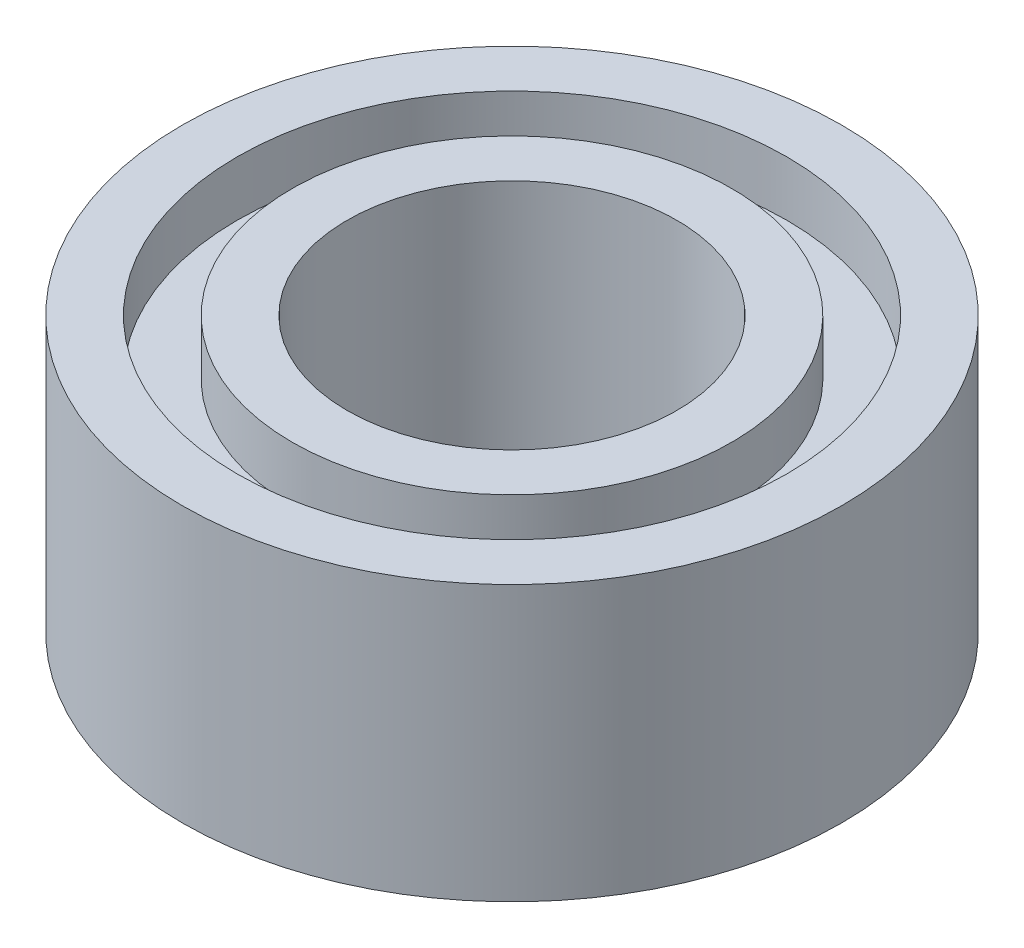
ISO-10303-21;
HEADER;
FILE_DESCRIPTION(('STEP AP214'),'2;1');
FILE_NAME('part.step','',(''),(''),'','','');
FILE_SCHEMA(('AUTOMOTIVE_DESIGN { 1 0 10303 214 1 1 1 1 }'));
ENDSEC;
DATA;
#1=APPLICATION_CONTEXT('core data for automotive mechanical design processes');
#2=APPLICATION_PROTOCOL_DEFINITION('international standard','automotive_design',2000,#1);
#3=PRODUCT_CONTEXT('',#1,'mechanical');
#4=PRODUCT('Part','Part','',(#3));
#5=PRODUCT_RELATED_PRODUCT_CATEGORY('part','',(#4));
#6=PRODUCT_DEFINITION_FORMATION('','',#4);
#7=PRODUCT_DEFINITION_CONTEXT('part definition',#1,'design');
#8=PRODUCT_DEFINITION('design','',#6,#7);
#9=PRODUCT_DEFINITION_SHAPE('','',#8);
#10=(LENGTH_UNIT() NAMED_UNIT(*) SI_UNIT(.MILLI.,.METRE.));
#11=(NAMED_UNIT(*) PLANE_ANGLE_UNIT() SI_UNIT($,.RADIAN.));
#12=(NAMED_UNIT(*) SI_UNIT($,.STERADIAN.) SOLID_ANGLE_UNIT());
#13=UNCERTAINTY_MEASURE_WITH_UNIT(LENGTH_MEASURE(1.E-05),#10,'distance_accuracy_value','');
#14=(GEOMETRIC_REPRESENTATION_CONTEXT(3) GLOBAL_UNCERTAINTY_ASSIGNED_CONTEXT((#13)) GLOBAL_UNIT_ASSIGNED_CONTEXT((#10,
#11,#12)) REPRESENTATION_CONTEXT('',''));
#15=CARTESIAN_POINT('',(0.,0.,0.));
#16=DIRECTION('',(0.,0.,1.));
#17=DIRECTION('',(1.,0.,0.));
#18=AXIS2_PLACEMENT_3D('',#15,#16,#17);
#19=CARTESIAN_POINT('',(0.,0.,0.));
#20=DIRECTION('',(0.,1.,0.));
#21=DIRECTION('',(0.,0.,1.));
#22=AXIS2_PLACEMENT_3D('',#19,#20,#21);
#23=PLANE('',#22);
#24=CARTESIAN_POINT('',(0.,0.,0.));
#25=DIRECTION('',(0.,1.,0.));
#26=DIRECTION('',(0.,0.,1.));
#27=AXIS2_PLACEMENT_3D('',#24,#25,#26);
#28=CIRCLE('',#27,1.5);
#29=CARTESIAN_POINT('',(0.,0.,1.5));
#30=VERTEX_POINT('',#29);
#31=EDGE_CURVE('E46',#30,#30,#28,.T.);
#32=ORIENTED_EDGE('',*,*,#31,.T.);
#33=EDGE_LOOP('',(#32));
#34=FACE_BOUND('',#33,.T.);
#35=CARTESIAN_POINT('',(0.,0.,0.));
#36=DIRECTION('',(0.,-1.,0.));
#37=DIRECTION('',(0.,0.,-1.));
#38=AXIS2_PLACEMENT_3D('',#35,#36,#37);
#39=CIRCLE('',#38,2.);
#40=CARTESIAN_POINT('',(0.,0.,-2.));
#41=VERTEX_POINT('',#40);
#42=EDGE_CURVE('E70',#41,#41,#39,.T.);
#43=ORIENTED_EDGE('',*,*,#42,.T.);
#44=EDGE_LOOP('',(#43));
#45=FACE_BOUND('',#44,.T.);
#46=ADVANCED_FACE('F33',(#34,#45),#23,.F.);
#47=CARTESIAN_POINT('',(0.,2.5,0.));
#48=DIRECTION('',(0.,1.,0.));
#49=DIRECTION('',(0.,0.,1.));
#50=AXIS2_PLACEMENT_3D('',#47,#48,#49);
#51=PLANE('',#50);
#52=CARTESIAN_POINT('',(0.,2.5,0.));
#53=DIRECTION('',(0.,1.,0.));
#54=DIRECTION('',(0.,0.,1.));
#55=AXIS2_PLACEMENT_3D('',#52,#53,#54);
#56=CIRCLE('',#55,1.5);
#57=CARTESIAN_POINT('',(0.,2.5,1.5));
#58=VERTEX_POINT('',#57);
#59=EDGE_CURVE('E44',#58,#58,#56,.T.);
#60=ORIENTED_EDGE('',*,*,#59,.F.);
#61=EDGE_LOOP('',(#60));
#62=FACE_BOUND('',#61,.T.);
#63=CARTESIAN_POINT('',(0.,2.5,0.));
#64=DIRECTION('',(0.,1.,0.));
#65=DIRECTION('',(0.,0.,1.));
#66=AXIS2_PLACEMENT_3D('',#63,#64,#65);
#67=CIRCLE('',#66,2.);
#68=CARTESIAN_POINT('',(0.,2.5,2.));
#69=VERTEX_POINT('',#68);
#70=EDGE_CURVE('E58',#69,#69,#67,.T.);
#71=ORIENTED_EDGE('',*,*,#70,.T.);
#72=EDGE_LOOP('',(#71));
#73=FACE_BOUND('',#72,.T.);
#74=ADVANCED_FACE('F109',(#62,#73),#51,.T.);
#75=CARTESIAN_POINT('',(0.,2.5,0.));
#76=DIRECTION('',(0.,1.,0.));
#77=DIRECTION('',(0.,0.,1.));
#78=AXIS2_PLACEMENT_3D('',#75,#76,#77);
#79=CIRCLE('',#78,2.5);
#80=CARTESIAN_POINT('',(0.,2.5,2.5));
#81=VERTEX_POINT('',#80);
#82=EDGE_CURVE('E52',#81,#81,#79,.T.);
#83=ORIENTED_EDGE('',*,*,#82,.F.);
#84=EDGE_LOOP('',(#83));
#85=FACE_BOUND('',#84,.T.);
#86=CARTESIAN_POINT('',(0.,2.5,0.));
#87=DIRECTION('',(0.,1.,0.));
#88=DIRECTION('',(0.,0.,1.));
#89=AXIS2_PLACEMENT_3D('',#86,#87,#88);
#90=CIRCLE('',#89,3.);
#91=CARTESIAN_POINT('',(0.,2.5,3.));
#92=VERTEX_POINT('',#91);
#93=EDGE_CURVE('E10',#92,#92,#90,.T.);
#94=ORIENTED_EDGE('',*,*,#93,.T.);
#95=EDGE_LOOP('',(#94));
#96=FACE_BOUND('',#95,.T.);
#97=ADVANCED_FACE('F95',(#85,#96),#51,.T.);
#98=CARTESIAN_POINT('',(0.,0.,0.));
#99=DIRECTION('',(0.,-1.,0.));
#100=DIRECTION('',(0.,0.,-1.));
#101=AXIS2_PLACEMENT_3D('',#98,#99,#100);
#102=CIRCLE('',#101,2.5);
#103=CARTESIAN_POINT('',(0.,0.,-2.5));
#104=VERTEX_POINT('',#103);
#105=EDGE_CURVE('E64',#104,#104,#102,.T.);
#106=ORIENTED_EDGE('',*,*,#105,.F.);
#107=EDGE_LOOP('',(#106));
#108=FACE_BOUND('',#107,.T.);
#109=CARTESIAN_POINT('',(0.,0.,0.));
#110=DIRECTION('',(0.,1.,0.));
#111=DIRECTION('',(0.,0.,1.));
#112=AXIS2_PLACEMENT_3D('',#109,#110,#111);
#113=CIRCLE('',#112,3.);
#114=CARTESIAN_POINT('',(0.,0.,3.));
#115=VERTEX_POINT('',#114);
#116=EDGE_CURVE('E37',#115,#115,#113,.T.);
#117=ORIENTED_EDGE('',*,*,#116,.F.);
#118=EDGE_LOOP('',(#117));
#119=FACE_BOUND('',#118,.T.);
#120=ADVANCED_FACE('F92',(#108,#119),#23,.F.);
#121=CARTESIAN_POINT('',(0.,2.5,0.));
#122=DIRECTION('',(0.,-1.,0.));
#123=DIRECTION('',(0.,0.,-1.));
#124=AXIS2_PLACEMENT_3D('',#121,#122,#123);
#125=CYLINDRICAL_SURFACE('',#124,3.);
#126=ORIENTED_EDGE('',*,*,#93,.F.);
#127=EDGE_LOOP('',(#126));
#128=FACE_BOUND('',#127,.T.);
#129=ORIENTED_EDGE('',*,*,#116,.T.);
#130=EDGE_LOOP('',(#129));
#131=FACE_BOUND('',#130,.T.);
#132=ADVANCED_FACE('F35',(#128,#131),#125,.T.);
#133=CARTESIAN_POINT('',(0.,2.5,0.));
#134=DIRECTION('',(0.,-1.,0.));
#135=DIRECTION('',(0.,0.,-1.));
#136=AXIS2_PLACEMENT_3D('',#133,#134,#135);
#137=CYLINDRICAL_SURFACE('',#136,1.5);
#138=ORIENTED_EDGE('',*,*,#59,.T.);
#139=EDGE_LOOP('',(#138));
#140=FACE_BOUND('',#139,.T.);
#141=ORIENTED_EDGE('',*,*,#31,.F.);
#142=EDGE_LOOP('',(#141));
#143=FACE_BOUND('',#142,.T.);
#144=ADVANCED_FACE('F99',(#140,#143),#137,.F.);
#145=CARTESIAN_POINT('',(0.,2.,0.));
#146=DIRECTION('',(0.,1.,0.));
#147=DIRECTION('',(0.,0.,1.));
#148=AXIS2_PLACEMENT_3D('',#145,#146,#147);
#149=CYLINDRICAL_SURFACE('',#148,2.5);
#150=CARTESIAN_POINT('',(0.,2.,0.));
#151=DIRECTION('',(0.,1.,0.));
#152=DIRECTION('',(0.,0.,1.));
#153=AXIS2_PLACEMENT_3D('',#150,#151,#152);
#154=CIRCLE('',#153,2.5);
#155=CARTESIAN_POINT('',(0.,2.,2.5));
#156=VERTEX_POINT('',#155);
#157=EDGE_CURVE('E49',#156,#156,#154,.T.);
#158=ORIENTED_EDGE('',*,*,#157,.F.);
#159=EDGE_LOOP('',(#158));
#160=FACE_BOUND('',#159,.T.);
#161=ORIENTED_EDGE('',*,*,#82,.T.);
#162=EDGE_LOOP('',(#161));
#163=FACE_BOUND('',#162,.T.);
#164=ADVANCED_FACE('F105',(#160,#163),#149,.F.);
#165=CARTESIAN_POINT('',(0.,2.,0.));
#166=DIRECTION('',(0.,1.,0.));
#167=DIRECTION('',(0.,0.,1.));
#168=AXIS2_PLACEMENT_3D('',#165,#166,#167);
#169=PLANE('',#168);
#170=CARTESIAN_POINT('',(0.,2.,0.));
#171=DIRECTION('',(0.,1.,0.));
#172=DIRECTION('',(0.,0.,1.));
#173=AXIS2_PLACEMENT_3D('',#170,#171,#172);
#174=CIRCLE('',#173,2.);
#175=CARTESIAN_POINT('',(0.,2.,2.));
#176=VERTEX_POINT('',#175);
#177=EDGE_CURVE('E55',#176,#176,#174,.T.);
#178=ORIENTED_EDGE('',*,*,#177,.F.);
#179=EDGE_LOOP('',(#178));
#180=FACE_BOUND('',#179,.T.);
#181=ORIENTED_EDGE('',*,*,#157,.T.);
#182=EDGE_LOOP('',(#181));
#183=FACE_BOUND('',#182,.T.);
#184=ADVANCED_FACE('F123',(#180,#183),#169,.T.);
#185=CARTESIAN_POINT('',(0.,2.,0.));
#186=DIRECTION('',(0.,1.,0.));
#187=DIRECTION('',(0.,0.,1.));
#188=AXIS2_PLACEMENT_3D('',#185,#186,#187);
#189=CYLINDRICAL_SURFACE('',#188,2.);
#190=ORIENTED_EDGE('',*,*,#177,.T.);
#191=EDGE_LOOP('',(#190));
#192=FACE_BOUND('',#191,.T.);
#193=ORIENTED_EDGE('',*,*,#70,.F.);
#194=EDGE_LOOP('',(#193));
#195=FACE_BOUND('',#194,.T.);
#196=ADVANCED_FACE('F88',(#192,#195),#189,.T.);
#197=CARTESIAN_POINT('',(0.,0.5,0.));
#198=DIRECTION('',(0.,-1.,0.));
#199=DIRECTION('',(0.,0.,-1.));
#200=AXIS2_PLACEMENT_3D('',#197,#198,#199);
#201=CYLINDRICAL_SURFACE('',#200,2.5);
#202=CARTESIAN_POINT('',(0.,0.5,0.));
#203=DIRECTION('',(0.,-1.,0.));
#204=DIRECTION('',(0.,0.,-1.));
#205=AXIS2_PLACEMENT_3D('',#202,#203,#204);
#206=CIRCLE('',#205,2.5);
#207=CARTESIAN_POINT('',(0.,0.5,-2.5));
#208=VERTEX_POINT('',#207);
#209=EDGE_CURVE('E61',#208,#208,#206,.T.);
#210=ORIENTED_EDGE('',*,*,#209,.F.);
#211=EDGE_LOOP('',(#210));
#212=FACE_BOUND('',#211,.T.);
#213=ORIENTED_EDGE('',*,*,#105,.T.);
#214=EDGE_LOOP('',(#213));
#215=FACE_BOUND('',#214,.T.);
#216=ADVANCED_FACE('F82',(#212,#215),#201,.F.);
#217=CARTESIAN_POINT('',(0.,0.5,0.));
#218=DIRECTION('',(0.,-1.,0.));
#219=DIRECTION('',(0.,0.,-1.));
#220=AXIS2_PLACEMENT_3D('',#217,#218,#219);
#221=PLANE('',#220);
#222=CARTESIAN_POINT('',(0.,0.5,0.));
#223=DIRECTION('',(0.,-1.,0.));
#224=DIRECTION('',(0.,0.,-1.));
#225=AXIS2_PLACEMENT_3D('',#222,#223,#224);
#226=CIRCLE('',#225,2.);
#227=CARTESIAN_POINT('',(0.,0.5,-2.));
#228=VERTEX_POINT('',#227);
#229=EDGE_CURVE('E67',#228,#228,#226,.T.);
#230=ORIENTED_EDGE('',*,*,#229,.F.);
#231=EDGE_LOOP('',(#230));
#232=FACE_BOUND('',#231,.T.);
#233=ORIENTED_EDGE('',*,*,#209,.T.);
#234=EDGE_LOOP('',(#233));
#235=FACE_BOUND('',#234,.T.);
#236=ADVANCED_FACE('F79',(#232,#235),#221,.T.);
#237=CARTESIAN_POINT('',(0.,0.5,0.));
#238=DIRECTION('',(0.,-1.,0.));
#239=DIRECTION('',(0.,0.,-1.));
#240=AXIS2_PLACEMENT_3D('',#237,#238,#239);
#241=CYLINDRICAL_SURFACE('',#240,2.);
#242=ORIENTED_EDGE('',*,*,#229,.T.);
#243=EDGE_LOOP('',(#242));
#244=FACE_BOUND('',#243,.T.);
#245=ORIENTED_EDGE('',*,*,#42,.F.);
#246=EDGE_LOOP('',(#245));
#247=FACE_BOUND('',#246,.T.);
#248=ADVANCED_FACE('F76',(#244,#247),#241,.T.);
#249=CLOSED_SHELL('',(#46,#74,#97,#120,#132,#144,#164,#184,#196,#216,#236,#248));
#250=MANIFOLD_SOLID_BREP('B2',#249);
#251=ADVANCED_BREP_SHAPE_REPRESENTATION('',(#18,#250),#14);
#252=SHAPE_DEFINITION_REPRESENTATION(#9,#251);
ENDSEC;
END-ISO-10303-21;
